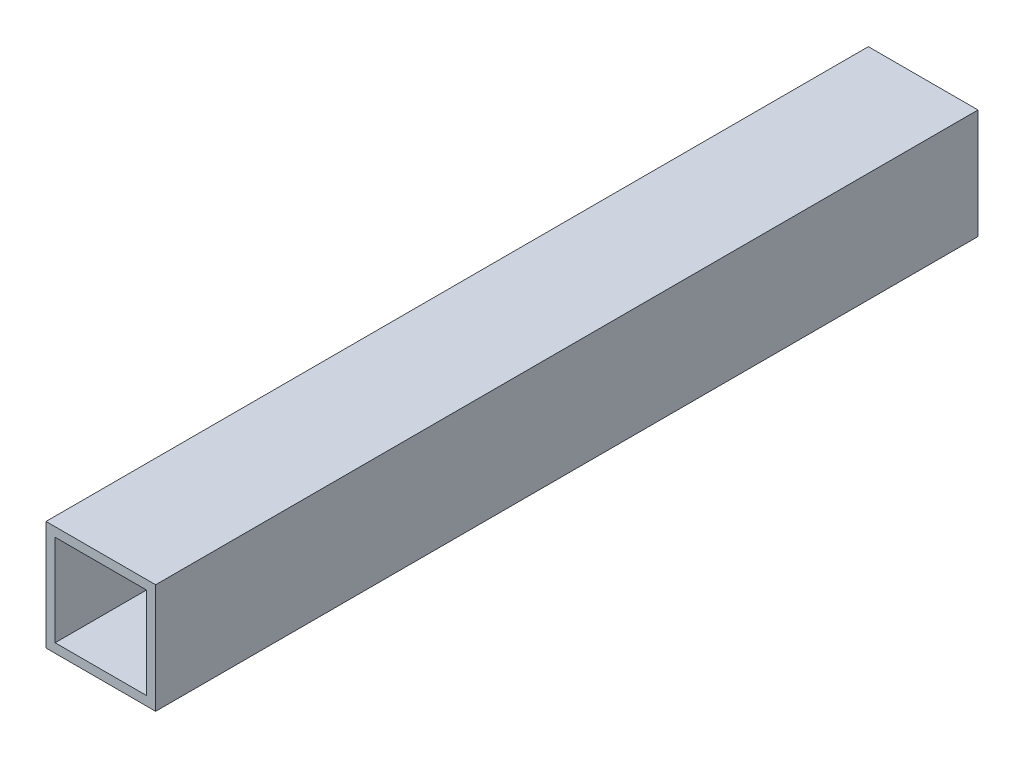
ISO-10303-21;
HEADER;
FILE_DESCRIPTION(('STEP AP214'),'2;1');
FILE_NAME('part.step','',(''),(''),'','','');
FILE_SCHEMA(('AUTOMOTIVE_DESIGN { 1 0 10303 214 1 1 1 1 }'));
ENDSEC;
DATA;
#1=APPLICATION_CONTEXT('core data for automotive mechanical design processes');
#2=APPLICATION_PROTOCOL_DEFINITION('international standard','automotive_design',2000,#1);
#3=PRODUCT_CONTEXT('',#1,'mechanical');
#4=PRODUCT('Part','Part','',(#3));
#5=PRODUCT_RELATED_PRODUCT_CATEGORY('part','',(#4));
#6=PRODUCT_DEFINITION_FORMATION('','',#4);
#7=PRODUCT_DEFINITION_CONTEXT('part definition',#1,'design');
#8=PRODUCT_DEFINITION('design','',#6,#7);
#9=PRODUCT_DEFINITION_SHAPE('','',#8);
#10=(LENGTH_UNIT() NAMED_UNIT(*) SI_UNIT(.MILLI.,.METRE.));
#11=(NAMED_UNIT(*) PLANE_ANGLE_UNIT() SI_UNIT($,.RADIAN.));
#12=(NAMED_UNIT(*) SI_UNIT($,.STERADIAN.) SOLID_ANGLE_UNIT());
#13=UNCERTAINTY_MEASURE_WITH_UNIT(LENGTH_MEASURE(1.E-05),#10,'distance_accuracy_value','');
#14=(GEOMETRIC_REPRESENTATION_CONTEXT(3) GLOBAL_UNCERTAINTY_ASSIGNED_CONTEXT((#13)) GLOBAL_UNIT_ASSIGNED_CONTEXT((#10,
#11,#12)) REPRESENTATION_CONTEXT('',''));
#15=CARTESIAN_POINT('',(0.,0.,0.));
#16=DIRECTION('',(0.,0.,1.));
#17=DIRECTION('',(1.,0.,0.));
#18=AXIS2_PLACEMENT_3D('',#15,#16,#17);
#19=CARTESIAN_POINT('',(0.,0.,180.));
#20=DIRECTION('',(0.,0.,1.));
#21=DIRECTION('',(1.,0.,0.));
#22=AXIS2_PLACEMENT_3D('',#19,#20,#21);
#23=PLANE('',#22);
#24=DIRECTION('',(0.,-1.,0.));
#25=VECTOR('',#24,1.);
#26=CARTESIAN_POINT('',(-12.,12.,180.));
#27=LINE('',#26,#25);
#28=CARTESIAN_POINT('',(-12.,12.,180.));
#29=VERTEX_POINT('',#28);
#30=CARTESIAN_POINT('',(-12.,-12.,180.));
#31=VERTEX_POINT('',#30);
#32=EDGE_CURVE('E136',#29,#31,#27,.T.);
#33=ORIENTED_EDGE('',*,*,#32,.T.);
#34=DIRECTION('',(1.,0.,0.));
#35=VECTOR('',#34,1.);
#36=CARTESIAN_POINT('',(-12.,-12.,180.));
#37=LINE('',#36,#35);
#38=CARTESIAN_POINT('',(12.,-12.,180.));
#39=VERTEX_POINT('',#38);
#40=EDGE_CURVE('E139',#31,#39,#37,.T.);
#41=ORIENTED_EDGE('',*,*,#40,.T.);
#42=DIRECTION('',(0.,1.,0.));
#43=VECTOR('',#42,1.);
#44=CARTESIAN_POINT('',(12.,12.,180.));
#45=LINE('',#44,#43);
#46=CARTESIAN_POINT('',(12.,12.,180.));
#47=VERTEX_POINT('',#46);
#48=EDGE_CURVE('E142',#39,#47,#45,.T.);
#49=ORIENTED_EDGE('',*,*,#48,.T.);
#50=DIRECTION('',(-1.,0.,0.));
#51=VECTOR('',#50,1.);
#52=CARTESIAN_POINT('',(-12.,12.,180.));
#53=LINE('',#52,#51);
#54=EDGE_CURVE('E144',#47,#29,#53,.T.);
#55=ORIENTED_EDGE('',*,*,#54,.T.);
#56=EDGE_LOOP('',(#33,#41,#49,#55));
#57=FACE_BOUND('',#56,.T.);
#58=DIRECTION('',(-1.,0.,0.));
#59=VECTOR('',#58,1.);
#60=CARTESIAN_POINT('',(-10.,10.,180.));
#61=LINE('',#60,#59);
#62=CARTESIAN_POINT('',(10.,10.,180.));
#63=VERTEX_POINT('',#62);
#64=CARTESIAN_POINT('',(-10.,10.,180.));
#65=VERTEX_POINT('',#64);
#66=EDGE_CURVE('E108',#63,#65,#61,.T.);
#67=ORIENTED_EDGE('',*,*,#66,.F.);
#68=DIRECTION('',(0.,1.,0.));
#69=VECTOR('',#68,1.);
#70=CARTESIAN_POINT('',(10.,10.,180.));
#71=LINE('',#70,#69);
#72=CARTESIAN_POINT('',(10.,-10.,180.));
#73=VERTEX_POINT('',#72);
#74=EDGE_CURVE('E100',#73,#63,#71,.T.);
#75=ORIENTED_EDGE('',*,*,#74,.F.);
#76=DIRECTION('',(1.,0.,0.));
#77=VECTOR('',#76,1.);
#78=CARTESIAN_POINT('',(-10.,-10.,180.));
#79=LINE('',#78,#77);
#80=CARTESIAN_POINT('',(-10.,-10.,180.));
#81=VERTEX_POINT('',#80);
#82=EDGE_CURVE('E122',#81,#73,#79,.T.);
#83=ORIENTED_EDGE('',*,*,#82,.F.);
#84=DIRECTION('',(0.,-1.,0.));
#85=VECTOR('',#84,1.);
#86=CARTESIAN_POINT('',(-10.,10.,180.));
#87=LINE('',#86,#85);
#88=EDGE_CURVE('E120',#65,#81,#87,.T.);
#89=ORIENTED_EDGE('',*,*,#88,.F.);
#90=EDGE_LOOP('',(#67,#75,#83,#89));
#91=FACE_BOUND('',#90,.T.);
#92=ADVANCED_FACE('F35',(#57,#91),#23,.T.);
#93=CARTESIAN_POINT('',(0.,0.,0.));
#94=DIRECTION('',(0.,0.,1.));
#95=DIRECTION('',(1.,0.,0.));
#96=AXIS2_PLACEMENT_3D('',#93,#94,#95);
#97=PLANE('',#96);
#98=DIRECTION('',(0.,-1.,0.));
#99=VECTOR('',#98,1.);
#100=CARTESIAN_POINT('',(-12.,12.,0.));
#101=LINE('',#100,#99);
#102=CARTESIAN_POINT('',(-12.,12.,0.));
#103=VERTEX_POINT('',#102);
#104=CARTESIAN_POINT('',(-12.,-12.,0.));
#105=VERTEX_POINT('',#104);
#106=EDGE_CURVE('E116',#103,#105,#101,.T.);
#107=ORIENTED_EDGE('',*,*,#106,.F.);
#108=DIRECTION('',(-1.,0.,0.));
#109=VECTOR('',#108,1.);
#110=CARTESIAN_POINT('',(-12.,12.,0.));
#111=LINE('',#110,#109);
#112=CARTESIAN_POINT('',(12.,12.,0.));
#113=VERTEX_POINT('',#112);
#114=EDGE_CURVE('E140',#113,#103,#111,.T.);
#115=ORIENTED_EDGE('',*,*,#114,.F.);
#116=DIRECTION('',(0.,1.,0.));
#117=VECTOR('',#116,1.);
#118=CARTESIAN_POINT('',(12.,12.,0.));
#119=LINE('',#118,#117);
#120=CARTESIAN_POINT('',(12.,-12.,0.));
#121=VERTEX_POINT('',#120);
#122=EDGE_CURVE('E151',#121,#113,#119,.T.);
#123=ORIENTED_EDGE('',*,*,#122,.F.);
#124=DIRECTION('',(1.,0.,0.));
#125=VECTOR('',#124,1.);
#126=CARTESIAN_POINT('',(-12.,-12.,0.));
#127=LINE('',#126,#125);
#128=EDGE_CURVE('E149',#105,#121,#127,.T.);
#129=ORIENTED_EDGE('',*,*,#128,.F.);
#130=EDGE_LOOP('',(#107,#115,#123,#129));
#131=FACE_BOUND('',#130,.T.);
#132=DIRECTION('',(0.,1.,0.));
#133=VECTOR('',#132,1.);
#134=CARTESIAN_POINT('',(10.,10.,0.));
#135=LINE('',#134,#133);
#136=CARTESIAN_POINT('',(10.,-10.,0.));
#137=VERTEX_POINT('',#136);
#138=CARTESIAN_POINT('',(10.,10.,0.));
#139=VERTEX_POINT('',#138);
#140=EDGE_CURVE('E58',#137,#139,#135,.T.);
#141=ORIENTED_EDGE('',*,*,#140,.T.);
#142=DIRECTION('',(-1.,0.,0.));
#143=VECTOR('',#142,1.);
#144=CARTESIAN_POINT('',(-10.,10.,0.));
#145=LINE('',#144,#143);
#146=CARTESIAN_POINT('',(-10.,10.,0.));
#147=VERTEX_POINT('',#146);
#148=EDGE_CURVE('E115',#139,#147,#145,.T.);
#149=ORIENTED_EDGE('',*,*,#148,.T.);
#150=DIRECTION('',(0.,-1.,0.));
#151=VECTOR('',#150,1.);
#152=CARTESIAN_POINT('',(-10.,10.,0.));
#153=LINE('',#152,#151);
#154=CARTESIAN_POINT('',(-10.,-10.,0.));
#155=VERTEX_POINT('',#154);
#156=EDGE_CURVE('E128',#147,#155,#153,.T.);
#157=ORIENTED_EDGE('',*,*,#156,.T.);
#158=DIRECTION('',(1.,0.,0.));
#159=VECTOR('',#158,1.);
#160=CARTESIAN_POINT('',(-10.,-10.,0.));
#161=LINE('',#160,#159);
#162=EDGE_CURVE('E109',#155,#137,#161,.T.);
#163=ORIENTED_EDGE('',*,*,#162,.T.);
#164=EDGE_LOOP('',(#141,#149,#157,#163));
#165=FACE_BOUND('',#164,.T.);
#166=ADVANCED_FACE('F169',(#131,#165),#97,.F.);
#167=CARTESIAN_POINT('',(-12.,12.,180.));
#168=DIRECTION('',(1.,0.,0.));
#169=DIRECTION('',(0.,1.,0.));
#170=AXIS2_PLACEMENT_3D('',#167,#168,#169);
#171=PLANE('',#170);
#172=ORIENTED_EDGE('',*,*,#106,.T.);
#173=DIRECTION('',(0.,0.,-1.));
#174=VECTOR('',#173,1.);
#175=CARTESIAN_POINT('',(-12.,-12.,180.));
#176=LINE('',#175,#174);
#177=EDGE_CURVE('E11',#31,#105,#176,.T.);
#178=ORIENTED_EDGE('',*,*,#177,.F.);
#179=ORIENTED_EDGE('',*,*,#32,.F.);
#180=DIRECTION('',(0.,0.,-1.));
#181=VECTOR('',#180,1.);
#182=CARTESIAN_POINT('',(-12.,12.,180.));
#183=LINE('',#182,#181);
#184=EDGE_CURVE('E146',#29,#103,#183,.T.);
#185=ORIENTED_EDGE('',*,*,#184,.T.);
#186=EDGE_LOOP('',(#172,#178,#179,#185));
#187=FACE_BOUND('',#186,.T.);
#188=ADVANCED_FACE('F37',(#187),#171,.F.);
#189=CARTESIAN_POINT('',(-12.,-12.,180.));
#190=DIRECTION('',(0.,1.,0.));
#191=DIRECTION('',(-1.,0.,0.));
#192=AXIS2_PLACEMENT_3D('',#189,#190,#191);
#193=PLANE('',#192);
#194=ORIENTED_EDGE('',*,*,#128,.T.);
#195=DIRECTION('',(0.,0.,-1.));
#196=VECTOR('',#195,1.);
#197=CARTESIAN_POINT('',(12.,-12.,180.));
#198=LINE('',#197,#196);
#199=EDGE_CURVE('E43',#39,#121,#198,.T.);
#200=ORIENTED_EDGE('',*,*,#199,.F.);
#201=ORIENTED_EDGE('',*,*,#40,.F.);
#202=ORIENTED_EDGE('',*,*,#177,.T.);
#203=EDGE_LOOP('',(#194,#200,#201,#202));
#204=FACE_BOUND('',#203,.T.);
#205=ADVANCED_FACE('F179',(#204),#193,.F.);
#206=CARTESIAN_POINT('',(12.,12.,180.));
#207=DIRECTION('',(-1.,0.,0.));
#208=DIRECTION('',(0.,-1.,0.));
#209=AXIS2_PLACEMENT_3D('',#206,#207,#208);
#210=PLANE('',#209);
#211=ORIENTED_EDGE('',*,*,#122,.T.);
#212=DIRECTION('',(0.,0.,-1.));
#213=VECTOR('',#212,1.);
#214=CARTESIAN_POINT('',(12.,12.,180.));
#215=LINE('',#214,#213);
#216=EDGE_CURVE('E156',#47,#113,#215,.T.);
#217=ORIENTED_EDGE('',*,*,#216,.F.);
#218=ORIENTED_EDGE('',*,*,#48,.F.);
#219=ORIENTED_EDGE('',*,*,#199,.T.);
#220=EDGE_LOOP('',(#211,#217,#218,#219));
#221=FACE_BOUND('',#220,.T.);
#222=ADVANCED_FACE('F163',(#221),#210,.F.);
#223=CARTESIAN_POINT('',(-12.,12.,180.));
#224=DIRECTION('',(0.,-1.,0.));
#225=DIRECTION('',(0.,0.,-1.));
#226=AXIS2_PLACEMENT_3D('',#223,#224,#225);
#227=PLANE('',#226);
#228=ORIENTED_EDGE('',*,*,#114,.T.);
#229=ORIENTED_EDGE('',*,*,#184,.F.);
#230=ORIENTED_EDGE('',*,*,#54,.F.);
#231=ORIENTED_EDGE('',*,*,#216,.T.);
#232=EDGE_LOOP('',(#228,#229,#230,#231));
#233=FACE_BOUND('',#232,.T.);
#234=ADVANCED_FACE('F173',(#233),#227,.F.);
#235=CARTESIAN_POINT('',(10.,10.,180.));
#236=DIRECTION('',(-1.,0.,0.));
#237=DIRECTION('',(0.,0.,1.));
#238=AXIS2_PLACEMENT_3D('',#235,#236,#237);
#239=PLANE('',#238);
#240=ORIENTED_EDGE('',*,*,#140,.F.);
#241=DIRECTION('',(0.,0.,-1.));
#242=VECTOR('',#241,1.);
#243=CARTESIAN_POINT('',(10.,-10.,180.));
#244=LINE('',#243,#242);
#245=EDGE_CURVE('E104',#73,#137,#244,.T.);
#246=ORIENTED_EDGE('',*,*,#245,.F.);
#247=ORIENTED_EDGE('',*,*,#74,.T.);
#248=DIRECTION('',(0.,0.,-1.));
#249=VECTOR('',#248,1.);
#250=CARTESIAN_POINT('',(10.,10.,180.));
#251=LINE('',#250,#249);
#252=EDGE_CURVE('E103',#63,#139,#251,.T.);
#253=ORIENTED_EDGE('',*,*,#252,.T.);
#254=EDGE_LOOP('',(#240,#246,#247,#253));
#255=FACE_BOUND('',#254,.T.);
#256=ADVANCED_FACE('F102',(#255),#239,.T.);
#257=CARTESIAN_POINT('',(-10.,10.,180.));
#258=DIRECTION('',(0.,-1.,0.));
#259=DIRECTION('',(0.,0.,-1.));
#260=AXIS2_PLACEMENT_3D('',#257,#258,#259);
#261=PLANE('',#260);
#262=ORIENTED_EDGE('',*,*,#148,.F.);
#263=ORIENTED_EDGE('',*,*,#252,.F.);
#264=ORIENTED_EDGE('',*,*,#66,.T.);
#265=DIRECTION('',(0.,0.,-1.));
#266=VECTOR('',#265,1.);
#267=CARTESIAN_POINT('',(-10.,10.,180.));
#268=LINE('',#267,#266);
#269=EDGE_CURVE('E117',#65,#147,#268,.T.);
#270=ORIENTED_EDGE('',*,*,#269,.T.);
#271=EDGE_LOOP('',(#262,#263,#264,#270));
#272=FACE_BOUND('',#271,.T.);
#273=ADVANCED_FACE('F112',(#272),#261,.T.);
#274=CARTESIAN_POINT('',(-10.,10.,180.));
#275=DIRECTION('',(1.,0.,0.));
#276=DIRECTION('',(0.,1.,0.));
#277=AXIS2_PLACEMENT_3D('',#274,#275,#276);
#278=PLANE('',#277);
#279=ORIENTED_EDGE('',*,*,#156,.F.);
#280=ORIENTED_EDGE('',*,*,#269,.F.);
#281=ORIENTED_EDGE('',*,*,#88,.T.);
#282=DIRECTION('',(0.,0.,-1.));
#283=VECTOR('',#282,1.);
#284=CARTESIAN_POINT('',(-10.,-10.,180.));
#285=LINE('',#284,#283);
#286=EDGE_CURVE('E50',#81,#155,#285,.T.);
#287=ORIENTED_EDGE('',*,*,#286,.T.);
#288=EDGE_LOOP('',(#279,#280,#281,#287));
#289=FACE_BOUND('',#288,.T.);
#290=ADVANCED_FACE('F202',(#289),#278,.T.);
#291=CARTESIAN_POINT('',(-10.,-10.,180.));
#292=DIRECTION('',(0.,1.,0.));
#293=DIRECTION('',(0.,0.,1.));
#294=AXIS2_PLACEMENT_3D('',#291,#292,#293);
#295=PLANE('',#294);
#296=ORIENTED_EDGE('',*,*,#162,.F.);
#297=ORIENTED_EDGE('',*,*,#286,.F.);
#298=ORIENTED_EDGE('',*,*,#82,.T.);
#299=ORIENTED_EDGE('',*,*,#245,.T.);
#300=EDGE_LOOP('',(#296,#297,#298,#299));
#301=FACE_BOUND('',#300,.T.);
#302=ADVANCED_FACE('F206',(#301),#295,.T.);
#303=CLOSED_SHELL('',(#92,#166,#188,#205,#222,#234,#256,#273,#290,#302));
#304=MANIFOLD_SOLID_BREP('B2',#303);
#305=ADVANCED_BREP_SHAPE_REPRESENTATION('',(#18,#304),#14);
#306=SHAPE_DEFINITION_REPRESENTATION(#9,#305);
ENDSEC;
END-ISO-10303-21;
